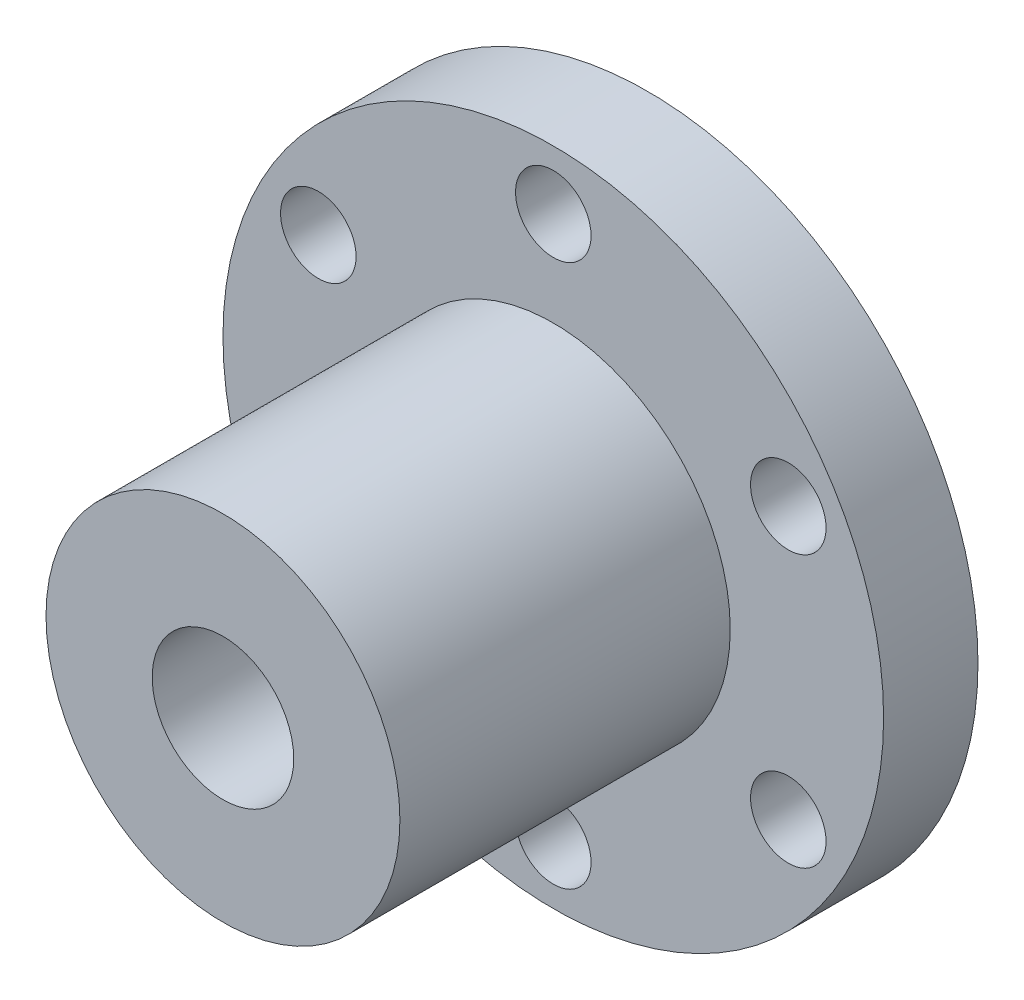
ISO-10303-21;
HEADER;
FILE_DESCRIPTION(('STEP AP214'),'2;1');
FILE_NAME('part.step','',(''),(''),'','','');
FILE_SCHEMA(('AUTOMOTIVE_DESIGN { 1 0 10303 214 1 1 1 1 }'));
ENDSEC;
DATA;
#1=APPLICATION_CONTEXT('core data for automotive mechanical design processes');
#2=APPLICATION_PROTOCOL_DEFINITION('international standard','automotive_design',2000,#1);
#3=PRODUCT_CONTEXT('',#1,'mechanical');
#4=PRODUCT('Part','Part','',(#3));
#5=PRODUCT_RELATED_PRODUCT_CATEGORY('part','',(#4));
#6=PRODUCT_DEFINITION_FORMATION('','',#4);
#7=PRODUCT_DEFINITION_CONTEXT('part definition',#1,'design');
#8=PRODUCT_DEFINITION('design','',#6,#7);
#9=PRODUCT_DEFINITION_SHAPE('','',#8);
#10=(LENGTH_UNIT() NAMED_UNIT(*) SI_UNIT(.MILLI.,.METRE.));
#11=(NAMED_UNIT(*) PLANE_ANGLE_UNIT() SI_UNIT($,.RADIAN.));
#12=(NAMED_UNIT(*) SI_UNIT($,.STERADIAN.) SOLID_ANGLE_UNIT());
#13=UNCERTAINTY_MEASURE_WITH_UNIT(LENGTH_MEASURE(1.E-05),#10,'distance_accuracy_value','');
#14=(GEOMETRIC_REPRESENTATION_CONTEXT(3) GLOBAL_UNCERTAINTY_ASSIGNED_CONTEXT((#13)) GLOBAL_UNIT_ASSIGNED_CONTEXT((#10,
#11,#12)) REPRESENTATION_CONTEXT('',''));
#15=CARTESIAN_POINT('',(0.,0.,0.));
#16=DIRECTION('',(0.,0.,1.));
#17=DIRECTION('',(1.,0.,0.));
#18=AXIS2_PLACEMENT_3D('',#15,#16,#17);
#19=CARTESIAN_POINT('',(0.,0.,4.));
#20=DIRECTION('',(0.,0.,-1.));
#21=DIRECTION('',(-1.,0.,0.));
#22=AXIS2_PLACEMENT_3D('',#19,#20,#21);
#23=CYLINDRICAL_SURFACE('',#22,14.);
#24=CARTESIAN_POINT('',(0.,0.,4.));
#25=DIRECTION('',(0.,0.,1.));
#26=DIRECTION('',(1.,0.,0.));
#27=AXIS2_PLACEMENT_3D('',#24,#25,#26);
#28=CIRCLE('',#27,14.);
#29=CARTESIAN_POINT('',(14.,0.,4.));
#30=VERTEX_POINT('',#29);
#31=EDGE_CURVE('E55',#30,#30,#28,.T.);
#32=ORIENTED_EDGE('',*,*,#31,.F.);
#33=EDGE_LOOP('',(#32));
#34=FACE_BOUND('',#33,.T.);
#35=CARTESIAN_POINT('',(0.,0.,0.));
#36=DIRECTION('',(0.,0.,1.));
#37=DIRECTION('',(1.,0.,0.));
#38=AXIS2_PLACEMENT_3D('',#35,#36,#37);
#39=CIRCLE('',#38,14.);
#40=CARTESIAN_POINT('',(14.,0.,0.));
#41=VERTEX_POINT('',#40);
#42=EDGE_CURVE('E51',#41,#41,#39,.T.);
#43=ORIENTED_EDGE('',*,*,#42,.T.);
#44=EDGE_LOOP('',(#43));
#45=FACE_BOUND('',#44,.T.);
#46=ADVANCED_FACE('F48',(#34,#45),#23,.T.);
#47=CARTESIAN_POINT('',(0.,0.,4.));
#48=DIRECTION('',(0.,0.,1.));
#49=DIRECTION('',(1.,0.,0.));
#50=AXIS2_PLACEMENT_3D('',#47,#48,#49);
#51=PLANE('',#50);
#52=CARTESIAN_POINT('',(0.,11.5,4.));
#53=DIRECTION('',(0.,0.,1.));
#54=DIRECTION('',(1.,0.,0.));
#55=AXIS2_PLACEMENT_3D('',#52,#53,#54);
#56=CIRCLE('',#55,1.6);
#57=CARTESIAN_POINT('',(1.6,11.5,4.));
#58=VERTEX_POINT('',#57);
#59=EDGE_CURVE('E94',#58,#58,#56,.T.);
#60=ORIENTED_EDGE('',*,*,#59,.F.);
#61=EDGE_LOOP('',(#60));
#62=FACE_BOUND('',#61,.T.);
#63=CARTESIAN_POINT('',(-9.95929214352087,5.74999999999969,4.));
#64=DIRECTION('',(0.,0.,1.));
#65=DIRECTION('',(1.,0.,0.));
#66=AXIS2_PLACEMENT_3D('',#63,#64,#65);
#67=CIRCLE('',#66,1.6);
#68=CARTESIAN_POINT('',(-8.35929214352087,5.74999999999969,4.));
#69=VERTEX_POINT('',#68);
#70=EDGE_CURVE('E99',#69,#69,#67,.T.);
#71=ORIENTED_EDGE('',*,*,#70,.F.);
#72=EDGE_LOOP('',(#71));
#73=FACE_BOUND('',#72,.T.);
#74=CARTESIAN_POINT('',(-9.95929214352051,-5.75000000000031,4.));
#75=DIRECTION('',(0.,0.,1.));
#76=DIRECTION('',(1.,0.,0.));
#77=AXIS2_PLACEMENT_3D('',#74,#75,#76);
#78=CIRCLE('',#77,1.6);
#79=CARTESIAN_POINT('',(-8.35929214352051,-5.75000000000031,4.));
#80=VERTEX_POINT('',#79);
#81=EDGE_CURVE('E75',#80,#80,#78,.T.);
#82=ORIENTED_EDGE('',*,*,#81,.F.);
#83=EDGE_LOOP('',(#82));
#84=FACE_BOUND('',#83,.T.);
#85=CARTESIAN_POINT('',(7.07358654082317E-13,-11.5,4.));
#86=DIRECTION('',(0.,0.,1.));
#87=DIRECTION('',(1.,0.,0.));
#88=AXIS2_PLACEMENT_3D('',#85,#86,#87);
#89=CIRCLE('',#88,1.6);
#90=CARTESIAN_POINT('',(1.60000000000071,-11.5,4.));
#91=VERTEX_POINT('',#90);
#92=EDGE_CURVE('E74',#91,#91,#89,.T.);
#93=ORIENTED_EDGE('',*,*,#92,.F.);
#94=EDGE_LOOP('',(#93));
#95=FACE_BOUND('',#94,.T.);
#96=CARTESIAN_POINT('',(9.95929214352158,-5.74999999999969,4.));
#97=DIRECTION('',(0.,0.,1.));
#98=DIRECTION('',(1.,0.,0.));
#99=AXIS2_PLACEMENT_3D('',#96,#97,#98);
#100=CIRCLE('',#99,1.6);
#101=CARTESIAN_POINT('',(11.5592921435216,-5.74999999999969,4.));
#102=VERTEX_POINT('',#101);
#103=EDGE_CURVE('E82',#102,#102,#100,.T.);
#104=ORIENTED_EDGE('',*,*,#103,.F.);
#105=EDGE_LOOP('',(#104));
#106=FACE_BOUND('',#105,.T.);
#107=CARTESIAN_POINT('',(9.95929214352122,5.75000000000031,4.));
#108=DIRECTION('',(0.,0.,1.));
#109=DIRECTION('',(1.,0.,0.));
#110=AXIS2_PLACEMENT_3D('',#107,#108,#109);
#111=CIRCLE('',#110,1.6);
#112=CARTESIAN_POINT('',(11.5592921435212,5.75000000000031,4.));
#113=VERTEX_POINT('',#112);
#114=EDGE_CURVE('E88',#113,#113,#111,.T.);
#115=ORIENTED_EDGE('',*,*,#114,.F.);
#116=EDGE_LOOP('',(#115));
#117=FACE_BOUND('',#116,.T.);
#118=CARTESIAN_POINT('',(0.,0.,4.));
#119=DIRECTION('',(0.,0.,1.));
#120=DIRECTION('',(1.,0.,0.));
#121=AXIS2_PLACEMENT_3D('',#118,#119,#120);
#122=CIRCLE('',#121,7.5);
#123=CARTESIAN_POINT('',(7.5,0.,4.));
#124=VERTEX_POINT('',#123);
#125=EDGE_CURVE('E12',#124,#124,#122,.T.);
#126=ORIENTED_EDGE('',*,*,#125,.F.);
#127=EDGE_LOOP('',(#126));
#128=FACE_BOUND('',#127,.T.);
#129=ORIENTED_EDGE('',*,*,#31,.T.);
#130=EDGE_LOOP('',(#129));
#131=FACE_BOUND('',#130,.T.);
#132=ADVANCED_FACE('F110',(#62,#73,#84,#95,#106,#117,#128,#131),#51,.T.);
#133=CARTESIAN_POINT('',(0.,0.,0.));
#134=DIRECTION('',(0.,0.,1.));
#135=DIRECTION('',(1.,0.,0.));
#136=AXIS2_PLACEMENT_3D('',#133,#134,#135);
#137=PLANE('',#136);
#138=CARTESIAN_POINT('',(0.,11.5,0.));
#139=DIRECTION('',(0.,0.,1.));
#140=DIRECTION('',(1.,0.,0.));
#141=AXIS2_PLACEMENT_3D('',#138,#139,#140);
#142=CIRCLE('',#141,1.6);
#143=CARTESIAN_POINT('',(1.6,11.5,0.));
#144=VERTEX_POINT('',#143);
#145=EDGE_CURVE('E70',#144,#144,#142,.F.);
#146=ORIENTED_EDGE('',*,*,#145,.F.);
#147=EDGE_LOOP('',(#146));
#148=FACE_BOUND('',#147,.T.);
#149=CARTESIAN_POINT('',(-9.95929214352087,5.74999999999969,0.));
#150=DIRECTION('',(0.,0.,1.));
#151=DIRECTION('',(1.,0.,0.));
#152=AXIS2_PLACEMENT_3D('',#149,#150,#151);
#153=CIRCLE('',#152,1.6);
#154=CARTESIAN_POINT('',(-8.35929214352087,5.74999999999969,0.));
#155=VERTEX_POINT('',#154);
#156=EDGE_CURVE('E78',#155,#155,#153,.F.);
#157=ORIENTED_EDGE('',*,*,#156,.F.);
#158=EDGE_LOOP('',(#157));
#159=FACE_BOUND('',#158,.T.);
#160=CARTESIAN_POINT('',(-9.95929214352051,-5.75000000000031,0.));
#161=DIRECTION('',(0.,0.,1.));
#162=DIRECTION('',(1.,0.,0.));
#163=AXIS2_PLACEMENT_3D('',#160,#161,#162);
#164=CIRCLE('',#163,1.6);
#165=CARTESIAN_POINT('',(-8.35929214352051,-5.75000000000031,0.));
#166=VERTEX_POINT('',#165);
#167=EDGE_CURVE('E71',#166,#166,#164,.F.);
#168=ORIENTED_EDGE('',*,*,#167,.F.);
#169=EDGE_LOOP('',(#168));
#170=FACE_BOUND('',#169,.T.);
#171=CARTESIAN_POINT('',(7.07358654082317E-13,-11.5,0.));
#172=DIRECTION('',(0.,0.,1.));
#173=DIRECTION('',(1.,0.,0.));
#174=AXIS2_PLACEMENT_3D('',#171,#172,#173);
#175=CIRCLE('',#174,1.6);
#176=CARTESIAN_POINT('',(1.60000000000071,-11.5,0.));
#177=VERTEX_POINT('',#176);
#178=EDGE_CURVE('E79',#177,#177,#175,.F.);
#179=ORIENTED_EDGE('',*,*,#178,.F.);
#180=EDGE_LOOP('',(#179));
#181=FACE_BOUND('',#180,.T.);
#182=CARTESIAN_POINT('',(9.95929214352158,-5.74999999999969,0.));
#183=DIRECTION('',(0.,0.,1.));
#184=DIRECTION('',(1.,0.,0.));
#185=AXIS2_PLACEMENT_3D('',#182,#183,#184);
#186=CIRCLE('',#185,1.6);
#187=CARTESIAN_POINT('',(11.5592921435216,-5.74999999999969,0.));
#188=VERTEX_POINT('',#187);
#189=EDGE_CURVE('E85',#188,#188,#186,.F.);
#190=ORIENTED_EDGE('',*,*,#189,.F.);
#191=EDGE_LOOP('',(#190));
#192=FACE_BOUND('',#191,.T.);
#193=CARTESIAN_POINT('',(9.95929214352122,5.75000000000031,0.));
#194=DIRECTION('',(0.,0.,1.));
#195=DIRECTION('',(1.,0.,0.));
#196=AXIS2_PLACEMENT_3D('',#193,#194,#195);
#197=CIRCLE('',#196,1.6);
#198=CARTESIAN_POINT('',(11.5592921435212,5.75000000000031,0.));
#199=VERTEX_POINT('',#198);
#200=EDGE_CURVE('E91',#199,#199,#197,.F.);
#201=ORIENTED_EDGE('',*,*,#200,.F.);
#202=EDGE_LOOP('',(#201));
#203=FACE_BOUND('',#202,.T.);
#204=CARTESIAN_POINT('',(0.,0.,0.));
#205=DIRECTION('',(0.,0.,1.));
#206=DIRECTION('',(1.,0.,0.));
#207=AXIS2_PLACEMENT_3D('',#204,#205,#206);
#208=CIRCLE('',#207,3.);
#209=CARTESIAN_POINT('',(3.,0.,0.));
#210=VERTEX_POINT('',#209);
#211=EDGE_CURVE('E64',#210,#210,#208,.F.);
#212=ORIENTED_EDGE('',*,*,#211,.F.);
#213=EDGE_LOOP('',(#212));
#214=FACE_BOUND('',#213,.T.);
#215=ORIENTED_EDGE('',*,*,#42,.F.);
#216=EDGE_LOOP('',(#215));
#217=FACE_BOUND('',#216,.T.);
#218=ADVANCED_FACE('F113',(#148,#159,#170,#181,#192,#203,#214,#217),#137,.F.);
#219=CARTESIAN_POINT('',(0.,0.,18.));
#220=DIRECTION('',(0.,0.,-1.));
#221=DIRECTION('',(-1.,0.,0.));
#222=AXIS2_PLACEMENT_3D('',#219,#220,#221);
#223=CYLINDRICAL_SURFACE('',#222,7.5);
#224=CARTESIAN_POINT('',(0.,0.,18.));
#225=DIRECTION('',(0.,0.,1.));
#226=DIRECTION('',(1.,0.,0.));
#227=AXIS2_PLACEMENT_3D('',#224,#225,#226);
#228=CIRCLE('',#227,7.5);
#229=CARTESIAN_POINT('',(7.5,0.,18.));
#230=VERTEX_POINT('',#229);
#231=EDGE_CURVE('E61',#230,#230,#228,.T.);
#232=ORIENTED_EDGE('',*,*,#231,.F.);
#233=EDGE_LOOP('',(#232));
#234=FACE_BOUND('',#233,.T.);
#235=ORIENTED_EDGE('',*,*,#125,.T.);
#236=EDGE_LOOP('',(#235));
#237=FACE_BOUND('',#236,.T.);
#238=ADVANCED_FACE('F134',(#234,#237),#223,.T.);
#239=CARTESIAN_POINT('',(0.,0.,18.));
#240=DIRECTION('',(0.,0.,1.));
#241=DIRECTION('',(1.,0.,0.));
#242=AXIS2_PLACEMENT_3D('',#239,#240,#241);
#243=PLANE('',#242);
#244=CARTESIAN_POINT('',(0.,0.,18.));
#245=DIRECTION('',(0.,0.,1.));
#246=DIRECTION('',(1.,0.,0.));
#247=AXIS2_PLACEMENT_3D('',#244,#245,#246);
#248=CIRCLE('',#247,3.);
#249=CARTESIAN_POINT('',(3.,0.,18.));
#250=VERTEX_POINT('',#249);
#251=EDGE_CURVE('E67',#250,#250,#248,.T.);
#252=ORIENTED_EDGE('',*,*,#251,.F.);
#253=EDGE_LOOP('',(#252));
#254=FACE_BOUND('',#253,.T.);
#255=ORIENTED_EDGE('',*,*,#231,.T.);
#256=EDGE_LOOP('',(#255));
#257=FACE_BOUND('',#256,.T.);
#258=ADVANCED_FACE('F139',(#254,#257),#243,.T.);
#259=CARTESIAN_POINT('',(0.,0.,-0.001000000000001));
#260=DIRECTION('',(0.,0.,1.));
#261=DIRECTION('',(1.,0.,0.));
#262=AXIS2_PLACEMENT_3D('',#259,#260,#261);
#263=CYLINDRICAL_SURFACE('',#262,3.);
#264=ORIENTED_EDGE('',*,*,#251,.T.);
#265=EDGE_LOOP('',(#264));
#266=FACE_BOUND('',#265,.T.);
#267=ORIENTED_EDGE('',*,*,#211,.T.);
#268=EDGE_LOOP('',(#267));
#269=FACE_BOUND('',#268,.T.);
#270=ADVANCED_FACE('F147',(#266,#269),#263,.F.);
#271=CARTESIAN_POINT('',(9.95929214352122,5.75000000000031,-0.00100000000000013));
#272=DIRECTION('',(0.,0.,1.));
#273=DIRECTION('',(1.,0.,0.));
#274=AXIS2_PLACEMENT_3D('',#271,#272,#273);
#275=CYLINDRICAL_SURFACE('',#274,1.6);
#276=ORIENTED_EDGE('',*,*,#114,.T.);
#277=EDGE_LOOP('',(#276));
#278=FACE_BOUND('',#277,.T.);
#279=ORIENTED_EDGE('',*,*,#200,.T.);
#280=EDGE_LOOP('',(#279));
#281=FACE_BOUND('',#280,.T.);
#282=ADVANCED_FACE('F151',(#278,#281),#275,.F.);
#283=CARTESIAN_POINT('',(9.95929214352158,-5.74999999999969,-0.00100000000000013));
#284=DIRECTION('',(0.,0.,1.));
#285=DIRECTION('',(1.,0.,0.));
#286=AXIS2_PLACEMENT_3D('',#283,#284,#285);
#287=CYLINDRICAL_SURFACE('',#286,1.6);
#288=ORIENTED_EDGE('',*,*,#103,.T.);
#289=EDGE_LOOP('',(#288));
#290=FACE_BOUND('',#289,.T.);
#291=ORIENTED_EDGE('',*,*,#189,.T.);
#292=EDGE_LOOP('',(#291));
#293=FACE_BOUND('',#292,.T.);
#294=ADVANCED_FACE('F161',(#290,#293),#287,.F.);
#295=CARTESIAN_POINT('',(7.07358654082317E-13,-11.5,-0.00100000000000013));
#296=DIRECTION('',(0.,0.,1.));
#297=DIRECTION('',(1.,0.,0.));
#298=AXIS2_PLACEMENT_3D('',#295,#296,#297);
#299=CYLINDRICAL_SURFACE('',#298,1.6);
#300=ORIENTED_EDGE('',*,*,#92,.T.);
#301=EDGE_LOOP('',(#300));
#302=FACE_BOUND('',#301,.T.);
#303=ORIENTED_EDGE('',*,*,#178,.T.);
#304=EDGE_LOOP('',(#303));
#305=FACE_BOUND('',#304,.T.);
#306=ADVANCED_FACE('F157',(#302,#305),#299,.F.);
#307=CARTESIAN_POINT('',(-9.95929214352051,-5.75000000000031,-0.00100000000000013));
#308=DIRECTION('',(0.,0.,1.));
#309=DIRECTION('',(1.,0.,0.));
#310=AXIS2_PLACEMENT_3D('',#307,#308,#309);
#311=CYLINDRICAL_SURFACE('',#310,1.6);
#312=ORIENTED_EDGE('',*,*,#81,.T.);
#313=EDGE_LOOP('',(#312));
#314=FACE_BOUND('',#313,.T.);
#315=ORIENTED_EDGE('',*,*,#167,.T.);
#316=EDGE_LOOP('',(#315));
#317=FACE_BOUND('',#316,.T.);
#318=ADVANCED_FACE('F153',(#314,#317),#311,.F.);
#319=CARTESIAN_POINT('',(-9.95929214352087,5.74999999999969,-0.00100000000000013));
#320=DIRECTION('',(0.,0.,1.));
#321=DIRECTION('',(1.,0.,0.));
#322=AXIS2_PLACEMENT_3D('',#319,#320,#321);
#323=CYLINDRICAL_SURFACE('',#322,1.6);
#324=ORIENTED_EDGE('',*,*,#70,.T.);
#325=EDGE_LOOP('',(#324));
#326=FACE_BOUND('',#325,.T.);
#327=ORIENTED_EDGE('',*,*,#156,.T.);
#328=EDGE_LOOP('',(#327));
#329=FACE_BOUND('',#328,.T.);
#330=ADVANCED_FACE('F156',(#326,#329),#323,.F.);
#331=CARTESIAN_POINT('',(0.,11.5,-0.00100000000000013));
#332=DIRECTION('',(0.,0.,1.));
#333=DIRECTION('',(1.,0.,0.));
#334=AXIS2_PLACEMENT_3D('',#331,#332,#333);
#335=CYLINDRICAL_SURFACE('',#334,1.6);
#336=ORIENTED_EDGE('',*,*,#59,.T.);
#337=EDGE_LOOP('',(#336));
#338=FACE_BOUND('',#337,.T.);
#339=ORIENTED_EDGE('',*,*,#145,.T.);
#340=EDGE_LOOP('',(#339));
#341=FACE_BOUND('',#340,.T.);
#342=ADVANCED_FACE('F107',(#338,#341),#335,.F.);
#343=CLOSED_SHELL('',(#46,#132,#218,#238,#258,#270,#282,#294,#306,#318,#330,#342));
#344=MANIFOLD_SOLID_BREP('B2',#343);
#345=ADVANCED_BREP_SHAPE_REPRESENTATION('',(#18,#344),#14);
#346=SHAPE_DEFINITION_REPRESENTATION(#9,#345);
ENDSEC;
END-ISO-10303-21;
